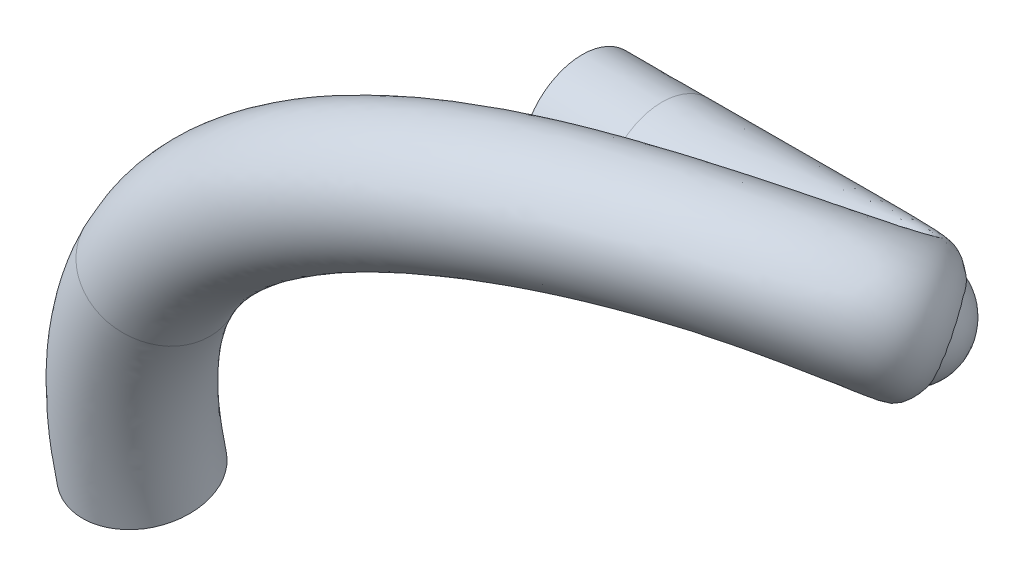
ISO-10303-21;
HEADER;
FILE_DESCRIPTION(('STEP AP214'),'2;1');
FILE_NAME('part.step','',(''),(''),'','','');
FILE_SCHEMA(('AUTOMOTIVE_DESIGN { 1 0 10303 214 1 1 1 1 }'));
ENDSEC;
DATA;
#1=APPLICATION_CONTEXT('core data for automotive mechanical design processes');
#2=APPLICATION_PROTOCOL_DEFINITION('international standard','automotive_design',2000,#1);
#3=PRODUCT_CONTEXT('',#1,'mechanical');
#4=PRODUCT('Part','Part','',(#3));
#5=PRODUCT_RELATED_PRODUCT_CATEGORY('part','',(#4));
#6=PRODUCT_DEFINITION_FORMATION('','',#4);
#7=PRODUCT_DEFINITION_CONTEXT('part definition',#1,'design');
#8=PRODUCT_DEFINITION('design','',#6,#7);
#9=PRODUCT_DEFINITION_SHAPE('','',#8);
#10=(LENGTH_UNIT() NAMED_UNIT(*) SI_UNIT(.MILLI.,.METRE.));
#11=(NAMED_UNIT(*) PLANE_ANGLE_UNIT() SI_UNIT($,.RADIAN.));
#12=(NAMED_UNIT(*) SI_UNIT($,.STERADIAN.) SOLID_ANGLE_UNIT());
#13=UNCERTAINTY_MEASURE_WITH_UNIT(LENGTH_MEASURE(1.E-05),#10,'distance_accuracy_value','');
#14=(GEOMETRIC_REPRESENTATION_CONTEXT(3) GLOBAL_UNCERTAINTY_ASSIGNED_CONTEXT((#13)) GLOBAL_UNIT_ASSIGNED_CONTEXT((#10,
#11,#12)) REPRESENTATION_CONTEXT('',''));
#15=CARTESIAN_POINT('',(0.,0.,0.));
#16=DIRECTION('',(0.,0.,1.));
#17=DIRECTION('',(1.,0.,0.));
#18=AXIS2_PLACEMENT_3D('',#15,#16,#17);
#19=CARTESIAN_POINT('',(0.,77.7946797883115,80.3650879164009));
#20=DIRECTION('',(0.,-0.97810611379634,-0.208106775848893));
#21=DIRECTION('',(-0.786276036500773,0.128584054759977,-0.604347694035576));
#22=AXIS2_PLACEMENT_3D('',#19,#20,#21);
#23=PLANE('',#22);
#24=CARTESIAN_POINT('',(-24.9642641588995,81.8772235269407,61.1770486307713));
#25=CARTESIAN_POINT('',(-30.10012505087,80.5171148322778,67.5695873852195));
#26=CARTESIAN_POINT('',(-32.5138841231119,78.7253930795708,75.9907163628611));
#27=CARTESIAN_POINT('',(-30.5343129763936,75.2903869238902,92.1353157306337));
#28=CARTESIAN_POINT('',(-26.1531726254029,73.6682547141992,99.7593703786035));
#29=CARTESIAN_POINT('',(-13.0819144780906,71.5306398113264,109.806204254691));
#30=CARTESIAN_POINT('',(-4.47228730281771,71.0283201931261,112.167116760482));
#31=CARTESIAN_POINT('',(12.0336920996729,71.4402823620331,110.230886119182));
#32=CARTESIAN_POINT('',(19.8284032669291,72.3520273550193,105.945665956479));
#33=CARTESIAN_POINT('',(30.10012505087,75.072244744345,93.1605884475822));
#34=CARTESIAN_POINT('',(32.5138841231119,76.8639664970521,84.7394594699407));
#35=CARTESIAN_POINT('',(30.5343129763937,80.2989726527326,68.5948601021681));
#36=CARTESIAN_POINT('',(26.153172625403,81.9211048624237,60.9708054541982));
#37=CARTESIAN_POINT('',(13.0819144780907,84.0587197652965,50.9239715781105));
#38=CARTESIAN_POINT('',(4.47228730281782,84.5610393834967,48.5630590723194));
#39=CARTESIAN_POINT('',(-12.0336920996728,84.1490772145897,50.4992897136193));
#40=CARTESIAN_POINT('',(-19.8284032669291,83.2373322216036,54.7845098763232));
#41=CARTESIAN_POINT('',(-24.9642641588995,81.8772235269407,61.1770486307713));
#42=B_SPLINE_CURVE_WITH_KNOTS('',3,(#24,#25,#26,#27,#28,#29,#30,#31,#32,#33,#34,#35,#36,#37,#38,
#39,#40,#41),.UNSPECIFIED.,.T.,.F.,(4,2,2,2,2,2,2,2,4),(0.,0.125,0.25,0.375,0.5,0.625,0.75,
0.875,1.),.UNSPECIFIED.);
#43=CARTESIAN_POINT('',(-24.9642641588995,81.8772235269407,61.1770486307713));
#44=VERTEX_POINT('',#43);
#45=EDGE_CURVE('E126',#44,#44,#42,.T.);
#46=ORIENTED_EDGE('',*,*,#45,.F.);
#47=EDGE_LOOP('',(#46));
#48=FACE_BOUND('',#47,.T.);
#49=ADVANCED_FACE('F45',(#48),#23,.T.);
#50=CARTESIAN_POINT('',(149.23,267.88,9.15933995315754E-13));
#51=DIRECTION('',(1.,0.,0.));
#52=DIRECTION('',(0.,0.,-1.));
#53=AXIS2_PLACEMENT_3D('',#50,#51,#52);
#54=PLANE('',#53);
#55=CARTESIAN_POINT('',(149.23,267.88,-31.7499999999991));
#56=CARTESIAN_POINT('',(149.23,276.192130562623,-31.7499999999991));
#57=CARTESIAN_POINT('',(149.23,284.453076415734,-28.3282041896106));
#58=CARTESIAN_POINT('',(149.23,296.208204189611,-16.5730764157333));
#59=CARTESIAN_POINT('',(149.23,299.63,-8.31213056262208));
#60=CARTESIAN_POINT('',(149.23,299.63,8.31213056262391));
#61=CARTESIAN_POINT('',(149.23,296.208204189611,16.5730764157351));
#62=CARTESIAN_POINT('',(149.23,284.453076415734,28.3282041896125));
#63=CARTESIAN_POINT('',(149.23,276.192130562623,31.7500000000009));
#64=CARTESIAN_POINT('',(149.23,259.567869437377,31.7500000000009));
#65=CARTESIAN_POINT('',(149.23,251.306923584266,28.3282041896125));
#66=CARTESIAN_POINT('',(149.23,239.551795810388,16.5730764157351));
#67=CARTESIAN_POINT('',(149.23,236.13,8.31213056262392));
#68=CARTESIAN_POINT('',(149.23,236.13,-8.31213056262207));
#69=CARTESIAN_POINT('',(149.23,239.551795810388,-16.5730764157333));
#70=CARTESIAN_POINT('',(149.23,251.306923584266,-28.3282041896106));
#71=CARTESIAN_POINT('',(149.23,259.567869437377,-31.7499999999991));
#72=CARTESIAN_POINT('',(149.23,267.88,-31.7499999999991));
#73=B_SPLINE_CURVE_WITH_KNOTS('',3,(#55,#56,#57,#58,#59,#60,#61,#62,#63,#64,#65,#66,#67,#68,#69,
#70,#71,#72),.UNSPECIFIED.,.T.,.F.,(4,2,2,2,2,2,2,2,4),(0.,0.125,0.25,0.375,0.5,0.625,0.75,
0.875,1.),.UNSPECIFIED.);
#74=CARTESIAN_POINT('',(149.23,267.88,-31.7499999999991));
#75=VERTEX_POINT('',#74);
#76=EDGE_CURVE('E59',#75,#75,#73,.T.);
#77=ORIENTED_EDGE('',*,*,#76,.F.);
#78=EDGE_LOOP('',(#77));
#79=FACE_BOUND('',#78,.T.);
#80=ADVANCED_FACE('F106',(#79),#54,.F.);
#81=CARTESIAN_POINT('',(4.98436154761423,205.538743408185,82.3359410502063));
#82=CARTESIAN_POINT('',(-13.9696499529726,171.847495775785,78.5948375263938));
#83=CARTESIAN_POINT('',(-25.072424811379,130.614782206991,71.6874000067005));
#84=CARTESIAN_POINT('',(-24.9642641588995,81.8772235269407,61.1770486307713));
#85=CARTESIAN_POINT('',(9.17506672756899,203.889008008475,75.3496800899277));
#86=CARTESIAN_POINT('',(-9.16188229056263,171.162992479714,71.7511725144789));
#87=CARTESIAN_POINT('',(-19.9726197620084,131.082144657172,65.0760000536511));
#88=CARTESIAN_POINT('',(-19.8284032669291,83.2373322216036,54.7845098763232));
#89=CARTESIAN_POINT('',(15.7694608624547,200.679559394852,70.2344818949174));
#90=CARTESIAN_POINT('',(-1.76051847680761,169.286484251854,66.840936594556));
#91=CARTESIAN_POINT('',(-12.2021217926382,130.77824518092,60.4882106189382));
#92=CARTESIAN_POINT('',(-12.0336920996728,84.1490772145897,50.4992897136193));
#93=CARTESIAN_POINT('',(30.0422209873294,192.953393185632,66.6344157040994));
#94=CARTESIAN_POINT('',(14.0503547350254,164.208995166282,63.6597990775961));
#95=CARTESIAN_POINT('',(4.29281694846403,128.799582808417,57.9502353266758));
#96=CARTESIAN_POINT('',(4.47228730281782,84.5610393834967,48.5630590723194));
#97=CARTESIAN_POINT('',(37.6326977095137,188.484252031646,68.1717163138964));
#98=CARTESIAN_POINT('',(22.3625036376363,161.039281025088,65.408486427253));
#99=CARTESIAN_POINT('',(12.9157093290807,127.13704825968,60.01568153296));
#100=CARTESIAN_POINT('',(13.0819144780907,84.0587197652965,50.9239715781105));
#101=CARTESIAN_POINT('',(49.4360183002746,180.857273809672,77.0529758037701));
#102=CARTESIAN_POINT('',(35.1069210909654,155.227636238036,74.597008904469));
#103=CARTESIAN_POINT('',(26.0436297742265,123.404361583702,69.6492733525902));
#104=CARTESIAN_POINT('',(26.153172625403,81.9211048624237,60.9708054541982));
#105=CARTESIAN_POINT('',(53.5761792954592,177.746402397358,84.3422453752548));
#106=CARTESIAN_POINT('',(39.4607116948822,152.621492677174,81.9802628970173));
#107=CARTESIAN_POINT('',(30.4678232892488,121.357188878404,77.1581252159709));
#108=CARTESIAN_POINT('',(30.5343129763937,80.2989726527326,68.5948601021681));
#109=CARTESIAN_POINT('',(55.9958352325577,174.68639256236,100.502309198044));
#110=CARTESIAN_POINT('',(41.6731667144009,149.480074464972,98.1559350994405));
#111=CARTESIAN_POINT('',(32.5385931605472,118.056987440081,93.3202361037685));
#112=CARTESIAN_POINT('',(32.5138841231119,76.8639664970521,84.7394594699407));
#113=CARTESIAN_POINT('',(54.2604303361892,174.756097165331,109.273592479056));
#114=CARTESIAN_POINT('',(39.5182069298508,148.964143685586,106.84874613591));
#115=CARTESIAN_POINT('',(30.172387062636,116.824229093993,101.873961516501));
#116=CARTESIAN_POINT('',(30.10012505087,75.072244744345,93.1605884475822));
#117=CARTESIAN_POINT('',(45.8790199766214,178.055567958776,123.246114412506));
#118=CARTESIAN_POINT('',(29.9026716567649,150.33314937266,120.536078111168));
#119=CARTESIAN_POINT('',(19.9727828367321,115.889401395599,115.096982948655));
#120=CARTESIAN_POINT('',(19.8284032669291,72.3520273550193,105.945665956479));
#121=CARTESIAN_POINT('',(39.2846258365245,181.265016561165,128.361312610758));
#122=CARTESIAN_POINT('',(22.5013070544874,152.209655900632,125.446314521821));
#123=CARTESIAN_POINT('',(12.2021953816326,116.193107955307,119.684828091094));
#124=CARTESIAN_POINT('',(12.0336920996729,71.4402823620331,110.230886119182));
#125=CARTESIAN_POINT('',(25.0118656979424,188.991182747482,131.961378797109));
#126=CARTESIAN_POINT('',(6.69043176776478,157.287141519189,128.627451362122));
#127=CARTESIAN_POINT('',(-4.29297891461475,118.171376697504,122.222726514317));
#128=CARTESIAN_POINT('',(-4.47228730281771,71.0283201931261,112.167116760482));
#129=CARTESIAN_POINT('',(17.4213889702286,193.460323894778,130.424078180575));
#130=CARTESIAN_POINT('',(-1.62171797129952,160.456854646799,126.878762992311));
#131=CARTESIAN_POINT('',(-12.915966194733,119.833796074818,120.157164445498));
#132=CARTESIAN_POINT('',(-13.0819144780906,71.5306398113264,109.806204254691));
#133=CARTESIAN_POINT('',(5.61806837899056,201.087302122514,121.542818677768));
#134=CARTESIAN_POINT('',(-14.3661354968493,166.26850030599,117.690238557405));
#135=CARTESIAN_POINT('',(-26.0438948383708,123.566581756061,110.523350388877));
#136=CARTESIAN_POINT('',(-26.1531726254029,73.6682547141992,99.7593703786035));
#137=CARTESIAN_POINT('',(1.4779073890179,204.198173546099,114.253549102954));
#138=CARTESIAN_POINT('',(-18.7199253124796,168.874645573335,110.306984061958));
#139=CARTESIAN_POINT('',(-30.4679989354685,125.613948235988,103.014441545741));
#140=CARTESIAN_POINT('',(-30.5343129763936,75.2903869238902,92.1353157306337));
#141=CARTESIAN_POINT('',(-0.94174853423754,207.25818340422,98.0934852846861));
#142=CARTESIAN_POINT('',(-20.9323782365987,172.016067285965,94.1313125433883));
#143=CARTESIAN_POINT('',(-32.5385309233311,128.914547097654,86.8524082343624));
#144=CARTESIAN_POINT('',(-32.5138841231119,78.7253930795708,75.9907163628611));
#145=CARTESIAN_POINT('',(0.793656367659463,207.188478807896,89.3222020104849));
#146=CARTESIAN_POINT('',(-18.7774176153825,172.531999071856,85.4385025383088));
#147=CARTESIAN_POINT('',(-30.1722298607496,130.147419756811,78.2987999597499));
#148=CARTESIAN_POINT('',(-30.10012505087,80.5171148322778,67.5695873852195));
#149=CARTESIAN_POINT('',(4.98436154761423,205.538743408185,82.3359410502063));
#150=CARTESIAN_POINT('',(-13.9696499529726,171.847495775785,78.5948375263938));
#151=CARTESIAN_POINT('',(-25.072424811379,130.614782206991,71.6874000067005));
#152=CARTESIAN_POINT('',(-24.9642641588995,81.8772235269407,61.1770486307713));
#153=B_SPLINE_SURFACE_WITH_KNOTS('',3,3,((#81,#82,#83,#84),(#85,#86,#87,#88),(#89,#90,#91,#92),
(#93,#94,#95,#96),(#97,#98,#99,#100),(#101,#102,#103,#104),(#105,#106,#107,#108),(#109,#110,
#111,#112),(#113,#114,#115,#116),(#117,#118,#119,#120),(#121,#122,#123,#124),(#125,#126,#127,
#128),(#129,#130,#131,#132),(#133,#134,#135,#136),(#137,#138,#139,#140),(#141,#142,#143,#144),
(#145,#146,#147,#148),(#149,#150,#151,#152)),.UNSPECIFIED.,.T.,.F.,.F.,(4,2,2,2,2,2,2,2,4),(4,
4),(0.,0.125,0.25,0.375,0.5,0.625,0.75,0.875,1.),(0.87555056375778,1.),.UNSPECIFIED.);
#154=CARTESIAN_POINT('',(4.98436154761423,205.538743408185,82.3359410502063));
#155=CARTESIAN_POINT('',(9.17506672756899,203.889008008475,75.3496800899277));
#156=CARTESIAN_POINT('',(15.7694608624547,200.679559394852,70.2344818949174));
#157=CARTESIAN_POINT('',(30.0422209873294,192.953393185632,66.6344157040994));
#158=CARTESIAN_POINT('',(37.6326977095137,188.484252031646,68.1717163138964));
#159=CARTESIAN_POINT('',(49.4360183002746,180.857273809672,77.0529758037701));
#160=CARTESIAN_POINT('',(53.5761792954592,177.746402397358,84.3422453752548));
#161=CARTESIAN_POINT('',(55.9958352325577,174.68639256236,100.502309198044));
#162=CARTESIAN_POINT('',(54.2604303361892,174.756097165331,109.273592479056));
#163=CARTESIAN_POINT('',(45.8790199766214,178.055567958776,123.246114412506));
#164=CARTESIAN_POINT('',(39.2846258365245,181.265016561165,128.361312610758));
#165=CARTESIAN_POINT('',(25.0118656979424,188.991182747482,131.961378797109));
#166=CARTESIAN_POINT('',(17.4213889702286,193.460323894778,130.424078180575));
#167=CARTESIAN_POINT('',(5.61806837899056,201.087302122514,121.542818677768));
#168=CARTESIAN_POINT('',(1.4779073890179,204.198173546099,114.253549102954));
#169=CARTESIAN_POINT('',(-0.94174853423754,207.25818340422,98.0934852846861));
#170=CARTESIAN_POINT('',(0.793656367659463,207.188478807896,89.3222020104849));
#171=CARTESIAN_POINT('',(4.98436154761423,205.538743408185,82.3359410502063));
#172=B_SPLINE_CURVE_WITH_KNOTS('',3,(#154,#155,#156,#157,#158,#159,#160,#161,#162,#163,#164,
#165,#166,#167,#168,#169,#170,#171),.UNSPECIFIED.,.T.,.F.,(4,2,2,2,2,2,2,2,4),(0.,0.125,0.25,
0.375,0.5,0.625,0.75,0.875,1.),.UNSPECIFIED.);
#173=CARTESIAN_POINT('',(4.98436154761423,205.538743408185,82.3359410502063));
#174=VERTEX_POINT('',#173);
#175=EDGE_CURVE('E54',#174,#174,#172,.F.);
#176=ORIENTED_EDGE('',*,*,#175,.F.);
#177=EDGE_LOOP('',(#176));
#178=FACE_BOUND('',#177,.T.);
#179=ORIENTED_EDGE('',*,*,#45,.T.);
#180=EDGE_LOOP('',(#179));
#181=FACE_BOUND('',#180,.T.);
#182=ADVANCED_FACE('F94',(#178,#181),#153,.T.);
#183=CARTESIAN_POINT('',(149.23,267.88,-31.7499999999991));
#184=CARTESIAN_POINT('',(164.952137417693,268.128101616908,-31.7500176062774));
#185=CARTESIAN_POINT('',(179.616615962847,268.541811044701,-31.6074749629089));
#186=CARTESIAN_POINT('',(193.28717742382,269.104079109609,-31.328169279097));
#187=CARTESIAN_POINT('',(149.23,276.192130562623,-31.7499999999991));
#188=CARTESIAN_POINT('',(164.891603180559,276.440164923122,-31.6850647554337));
#189=CARTESIAN_POINT('',(179.494438029569,276.853376250013,-31.4746429440781));
#190=CARTESIAN_POINT('',(193.09732674015,277.413319073549,-31.1264540207259));
#191=CARTESIAN_POINT('',(149.23,284.453076415734,-28.3282041896106));
#192=CARTESIAN_POINT('',(164.809201525555,284.674297522528,-28.1987814308829));
#193=CARTESIAN_POINT('',(179.328513714425,285.059389335438,-27.921109813111));
#194=CARTESIAN_POINT('',(192.840306192462,285.588293980301,-27.5053347330421));
#195=CARTESIAN_POINT('',(149.23,296.208204189611,-16.5730764157333));
#196=CARTESIAN_POINT('',(164.647229581259,296.3375325203,-16.3520167146675));
#197=CARTESIAN_POINT('',(179.00291879153,296.627064681963,-15.979073351153));
#198=CARTESIAN_POINT('',(192.337116262198,297.054010888756,-15.4688804995937));
#199=CARTESIAN_POINT('',(149.23,299.63,-8.31213056262208));
#200=CARTESIAN_POINT('',(164.568682018498,299.694840943821,-8.06445640985924));
#201=CARTESIAN_POINT('',(178.845291718597,299.917535148157,-7.66406244876623));
#202=CARTESIAN_POINT('',(192.0940894994,300.274194627999,-7.12761304504192));
#203=CARTESIAN_POINT('',(149.23,299.63,8.31213056262391));
#204=CARTESIAN_POINT('',(164.460854209474,299.565189977566,8.55968661756079));
#205=CARTESIAN_POINT('',(178.629440602845,299.653827801507,8.9591579671565));
#206=CARTESIAN_POINT('',(191.762462698835,299.870983683687,9.49140966155865));
#207=CARTESIAN_POINT('',(149.23,296.208204189611,16.5730764157351));
#208=CARTESIAN_POINT('',(164.432237542559,296.078998393139,16.7939266790896));
#209=CARTESIAN_POINT('',(178.572545116171,296.101227308834,17.1650441126282));
#210=CARTESIAN_POINT('',(191.675904056268,296.250018742241,17.6668730308091));
#211=CARTESIAN_POINT('',(149.23,284.453076415734,28.3282041896125));
#212=CARTESIAN_POINT('',(164.441714360087,284.232209517722,28.4574197237415));
#213=CARTESIAN_POINT('',(178.592875016448,284.160309296135,28.7320491333627));
#214=CARTESIAN_POINT('',(191.710096645689,284.213728041326,29.1335604660798));
#215=CARTESIAN_POINT('',(149.23,276.192130562623,31.7500000000009));
#216=CARTESIAN_POINT('',(164.479723320851,275.944537872156,31.8148196158563));
#217=CARTESIAN_POINT('',(178.669935365172,275.845484033323,32.0218927327322));
#218=CARTESIAN_POINT('',(191.830591809254,275.872476436889,32.3541202280524));
#219=CARTESIAN_POINT('',(149.23,259.567869437377,31.7500000000009));
#220=CARTESIAN_POINT('',(164.600782530077,259.320135794644,31.6851434846344));
#221=CARTESIAN_POINT('',(178.914277121945,259.221934113881,31.7565783104586));
#222=CARTESIAN_POINT('',(192.210277060692,259.253517353053,31.9510890361515));
#223=CARTESIAN_POINT('',(149.23,251.306923584266,28.3282041896125));
#224=CARTESIAN_POINT('',(164.683089011158,251.085806546521,28.1988423155714));
#225=CARTESIAN_POINT('',(179.08005649562,251.015621549906,28.2030180038933));
#226=CARTESIAN_POINT('',(192.467132058602,251.078200386853,28.3299387089612));
#227=CARTESIAN_POINT('',(149.23,239.551795810388,16.5730764157351));
#228=CARTESIAN_POINT('',(164.844825849156,239.422341972026,16.351802184368));
#229=CARTESIAN_POINT('',(179.40529337259,239.447596578457,16.2605621094054));
#230=CARTESIAN_POINT('',(192.969913034857,239.612084142657,16.2930054066854));
#231=CARTESIAN_POINT('',(149.23,236.13,8.31213056262392));
#232=CARTESIAN_POINT('',(164.923285419139,236.065051383082,8.06404511711669));
#233=CARTESIAN_POINT('',(179.562786440248,236.157153272737,7.94525155531718));
#234=CARTESIAN_POINT('',(193.212786738957,236.391931425653,7.95139569496499));
#235=CARTESIAN_POINT('',(149.23,236.13,-8.31213056262207));
#236=CARTESIAN_POINT('',(165.031122418092,236.194977849417,-8.5603276598429));
#237=CARTESIAN_POINT('',(179.778651551546,236.421280181497,-8.67831874871392));
#238=CARTESIAN_POINT('',(193.544429525115,236.79562158679,-8.66802664798071));
#239=CARTESIAN_POINT('',(149.23,239.551795810388,-16.5730764157333));
#240=CARTESIAN_POINT('',(165.05983426605,239.681366193646,-16.7945498547768));
#241=CARTESIAN_POINT('',(179.835691990481,239.974180321845,-16.8841776849541));
#242=CARTESIAN_POINT('',(193.63115372973,240.416928780799,-16.8434589393058));
#243=CARTESIAN_POINT('',(149.23,251.306923584266,-28.3282041896106));
#244=CARTESIAN_POINT('',(165.050592629108,251.528384606915,-28.4577673053765));
#245=CARTESIAN_POINT('',(179.815720249365,251.915447900269,-28.4507630004632));
#246=CARTESIAN_POINT('',(193.59737022377,252.453618749837,-28.3096669942841));
#247=CARTESIAN_POINT('',(149.23,259.567869437377,-31.7499999999991));
#248=CARTESIAN_POINT('',(165.012671654828,259.816038310695,-31.814970457121));
#249=CARTESIAN_POINT('',(179.738793896125,260.230245839389,-31.7403069817397));
#250=CARTESIAN_POINT('',(193.47702810749,260.794839145668,-31.529884537468));
#251=CARTESIAN_POINT('',(149.23,267.88,-31.7499999999991));
#252=CARTESIAN_POINT('',(164.952137417693,268.128101616908,-31.7500176062774));
#253=CARTESIAN_POINT('',(179.616615962847,268.541811044701,-31.6074749629089));
#254=CARTESIAN_POINT('',(193.28717742382,269.104079109609,-31.328169279097));
#255=B_SPLINE_SURFACE_WITH_KNOTS('',3,3,((#183,#184,#185,#186),(#187,#188,#189,#190),(#191,#192,
#193,#194),(#195,#196,#197,#198),(#199,#200,#201,#202),(#203,#204,#205,#206),(#207,#208,#209,
#210),(#211,#212,#213,#214),(#215,#216,#217,#218),(#219,#220,#221,#222),(#223,#224,#225,#226),
(#227,#228,#229,#230),(#231,#232,#233,#234),(#235,#236,#237,#238),(#239,#240,#241,#242),(#243,
#244,#245,#246),(#247,#248,#249,#250),(#251,#252,#253,#254)),.UNSPECIFIED.,.T.,.F.,.F.,(4,2,2,2,
2,2,2,2,4),(4,4),(0.,0.125,0.25,0.375,0.5,0.625,0.75,0.875,1.),(0.,0.0298180605057714),.UNSPECIFIED.);
#256=CARTESIAN_POINT('',(193.28717742382,269.104079109609,-31.328169279097));
#257=CARTESIAN_POINT('',(193.09732674015,277.413319073549,-31.1264540207259));
#258=CARTESIAN_POINT('',(192.840306192462,285.588293980301,-27.5053347330421));
#259=CARTESIAN_POINT('',(192.337116262198,297.054010888756,-15.4688804995937));
#260=CARTESIAN_POINT('',(192.0940894994,300.274194627999,-7.12761304504192));
#261=CARTESIAN_POINT('',(191.762462698835,299.870983683687,9.49140966155865));
#262=CARTESIAN_POINT('',(191.675904056268,296.250018742241,17.6668730308091));
#263=CARTESIAN_POINT('',(191.710096645689,284.213728041326,29.1335604660798));
#264=CARTESIAN_POINT('',(191.830591809254,275.872476436889,32.3541202280524));
#265=CARTESIAN_POINT('',(192.210277060692,259.253517353053,31.9510890361515));
#266=CARTESIAN_POINT('',(192.467132058602,251.078200386853,28.3299387089612));
#267=CARTESIAN_POINT('',(192.969913034857,239.612084142657,16.2930054066854));
#268=CARTESIAN_POINT('',(193.212786738957,236.391931425653,7.95139569496499));
#269=CARTESIAN_POINT('',(193.544429525115,236.79562158679,-8.66802664798071));
#270=CARTESIAN_POINT('',(193.63115372973,240.416928780799,-16.8434589393058));
#271=CARTESIAN_POINT('',(193.59737022377,252.453618749837,-28.3096669942841));
#272=CARTESIAN_POINT('',(193.47702810749,260.794839145668,-31.529884537468));
#273=CARTESIAN_POINT('',(193.28717742382,269.104079109609,-31.328169279097));
#274=B_SPLINE_CURVE_WITH_KNOTS('',3,(#256,#257,#258,#259,#260,#261,#262,#263,#264,#265,#266,
#267,#268,#269,#270,#271,#272,#273),.UNSPECIFIED.,.T.,.F.,(4,2,2,2,2,2,2,2,4),(0.,0.125,0.25,
0.375,0.5,0.625,0.75,0.875,1.),.UNSPECIFIED.);
#275=CARTESIAN_POINT('',(193.28717742382,269.104079109609,-31.328169279097));
#276=VERTEX_POINT('',#275);
#277=EDGE_CURVE('E11',#276,#276,#274,.T.);
#278=ORIENTED_EDGE('',*,*,#76,.T.);
#279=EDGE_LOOP('',(#278));
#280=FACE_BOUND('',#279,.T.);
#281=ORIENTED_EDGE('',*,*,#277,.F.);
#282=EDGE_LOOP('',(#281));
#283=FACE_BOUND('',#282,.T.);
#284=ADVANCED_FACE('F81',(#280,#283),#255,.T.);
#285=CARTESIAN_POINT('',(193.28717742382,269.104079109609,-31.328169279097));
#286=CARTESIAN_POINT('',(322.533658350056,274.419966751386,-28.6875113340344));
#287=CARTESIAN_POINT('',(424.212075655493,337.530915504561,38.2592622267894));
#288=CARTESIAN_POINT('',(199.531183978553,352.045598123335,73.4410407682274));
#289=CARTESIAN_POINT('',(47.9202024724882,281.858315592714,90.8105283837069));
#290=CARTESIAN_POINT('',(4.98436154761423,205.538743408185,82.3359410502063));
#291=CARTESIAN_POINT('',(193.09732674015,277.413319073549,-31.1264540207259));
#292=CARTESIAN_POINT('',(321.704004768188,282.707223034158,-27.8345487709496));
#293=CARTESIAN_POINT('',(414.40352382035,339.166089881334,30.6897899661791));
#294=CARTESIAN_POINT('',(199.689193453598,346.906577659175,66.0423198447075));
#295=CARTESIAN_POINT('',(50.713098192077,278.022074605193,83.5012499473979));
#296=CARTESIAN_POINT('',(9.17506672756899,203.889008008475,75.3496800899277));
#297=CARTESIAN_POINT('',(192.840306192462,285.588293980301,-27.5053347330421));
#298=CARTESIAN_POINT('',(320.585727167113,290.588751663706,-23.5744452732976));
#299=CARTESIAN_POINT('',(401.377288713703,336.902188089978,22.4306001895841));
#300=CARTESIAN_POINT('',(201.380376021784,338.791432353531,60.5752910041763));
#301=CARTESIAN_POINT('',(55.4794929210294,271.793164050027,77.9217580782847));
#302=CARTESIAN_POINT('',(15.7694608624547,200.679559394852,70.2344818949174));
#303=CARTESIAN_POINT('',(192.337116262198,297.054010888756,-15.4688804995937));
#304=CARTESIAN_POINT('',(318.403489174482,301.090516260563,-10.6453309441486));
#305=CARTESIAN_POINT('',(376.244411315757,325.854351267061,9.19618105916052));
#306=CARTESIAN_POINT('',(206.87421177394,321.19100702674,56.5914788935617));
#307=CARTESIAN_POINT('',(66.2680207595586,258.06704476288,73.3727078215301));
#308=CARTESIAN_POINT('',(30.0422209873294,192.953393185632,66.6344157040994));
#309=CARTESIAN_POINT('',(192.0940894994,300.274194627999,-7.12761304504192));
#310=CARTESIAN_POINT('',(317.353062553323,303.646183612517,-2.05582445579641));
#311=CARTESIAN_POINT('',(364.292488254299,317.138400420007,4.30239524288066));
#312=CARTESIAN_POINT('',(210.643047852509,311.814121151889,58.0992421073431));
#313=CARTESIAN_POINT('',(72.2237194328951,250.65435830645,74.4311616480975));
#314=CARTESIAN_POINT('',(37.6326977095137,188.484252031646,68.1717163138964));
#315=CARTESIAN_POINT('',(191.762462698835,299.870983683687,9.49140966155865));
#316=CARTESIAN_POINT('',(315.926850143998,301.924054705264,14.5235115737507));
#317=CARTESIAN_POINT('',(348.36604095047,298.243748890518,0.724702907134998));
#318=CARTESIAN_POINT('',(218.096571581612,297.201490645981,67.2628207687157));
#319=CARTESIAN_POINT('',(81.8952071298764,238.91517050895,82.6163893377252));
#320=CARTESIAN_POINT('',(49.4360183002746,180.857273809672,77.0529758037701));
#321=CARTESIAN_POINT('',(191.675904056268,296.250018742241,17.6668730308091));
#322=CARTESIAN_POINT('',(315.559845191797,297.65674729649,22.4113469053514));
#323=CARTESIAN_POINT('',(344.489589812448,288.181452335064,2.06278114536094));
#324=CARTESIAN_POINT('',(221.735361520672,292.055712663315,74.8622218358092));
#325=CARTESIAN_POINT('',(85.5514406516005,234.660957237851,89.6927593785765));
#326=CARTESIAN_POINT('',(53.5761792954592,177.746402397358,84.3422453752548));
#327=CARTESIAN_POINT('',(191.710096645689,284.213728041326,29.1335604660798));
#328=CARTESIAN_POINT('',(315.725100707431,284.718768368395,32.9295952488369));
#329=CARTESIAN_POINT('',(347.099075686711,272.508569762003,10.2372797379682));
#330=CARTESIAN_POINT('',(226.782398542699,288.990656471643,91.8053782635676));
#331=CARTESIAN_POINT('',(88.4404613791795,231.785358873409,105.817466100039));
#332=CARTESIAN_POINT('',(55.9958352325577,174.68639256236,100.502309198044));
#333=CARTESIAN_POINT('',(191.830591809254,275.872476436889,32.3541202280524));
#334=CARTESIAN_POINT('',(316.256244474118,276.127672478589,35.4951203076511));
#335=CARTESIAN_POINT('',(353.568990242892,266.994538868165,17.0234181498407));
#336=CARTESIAN_POINT('',(228.15955331898,291.090239315151,101.044784627029));
#337=CARTESIAN_POINT('',(87.6554590895431,233.181682256593,114.766509735821));
#338=CARTESIAN_POINT('',(54.2604303361892,174.756097165331,109.273592479056));
#339=CARTESIAN_POINT('',(192.210277060692,259.253517353053,31.9510890361515));
#340=CARTESIAN_POINT('',(317.915516555385,259.552116831271,33.7900644776492));
#341=CARTESIAN_POINT('',(373.186110269576,263.724677156481,32.1619564157287));
#342=CARTESIAN_POINT('',(227.843529745199,301.36814021962,115.842344423482));
#343=CARTESIAN_POINT('',(82.0696675342914,240.854166262334,129.385062230031));
#344=CARTESIAN_POINT('',(45.8790199766214,178.055567958776,123.246114412506));
#345=CARTESIAN_POINT('',(192.467132058602,251.078200386853,28.3299387089612));
#346=CARTESIAN_POINT('',(319.033433768189,251.669843566908,29.5298934096904));
#347=CARTESIAN_POINT('',(386.212513793182,265.988926953012,40.4211775782631));
#348=CARTESIAN_POINT('',(226.152298300152,309.483184459375,121.309364768701));
#349=CARTESIAN_POINT('',(77.3032745745336,247.083080631504,134.964552998109));
#350=CARTESIAN_POINT('',(39.2846258365245,181.265016561165,128.361312610758));
#351=CARTESIAN_POINT('',(192.969913034857,239.612084142657,16.2930054066854));
#352=CARTESIAN_POINT('',(321.214781503191,241.167209650096,16.5997361883764));
#353=CARTESIAN_POINT('',(411.345807265457,277.037170495558,53.6560835942962));
#354=CARTESIAN_POINT('',(220.658341674259,327.083490247364,125.293037117933));
#355=CARTESIAN_POINT('',(66.5147513914187,260.809207697582,139.513604773081));
#356=CARTESIAN_POINT('',(25.0118656979424,188.991182747482,131.961378797109));
#357=CARTESIAN_POINT('',(193.212786738957,236.391931425653,7.95139569496499));
#358=CARTESIAN_POINT('',(322.264874927621,238.611609830919,8.00948463520827));
#359=CARTESIAN_POINT('',(423.297886068962,285.753090130745,58.5502174125335));
#360=CARTESIAN_POINT('',(216.88946029365,336.460384064611,123.785173494514));
#361=CARTESIAN_POINT('',(60.5590545948113,268.221896428187,138.455153235423));
#362=CARTESIAN_POINT('',(17.4213889702286,193.460323894778,130.424078180575));
#363=CARTESIAN_POINT('',(193.544429525115,236.79562158679,-8.66802664798071));
#364=CARTESIAN_POINT('',(323.69112213718,240.334781952455,-8.57072136868377));
#365=CARTESIAN_POINT('',(439.224317154298,304.647254566043,62.1283163218679));
#366=CARTESIAN_POINT('',(209.435941128954,351.073154578736,114.62147678709));
#367=CARTESIAN_POINT('',(50.8875670598761,279.961082268889,130.26992993826));
#368=CARTESIAN_POINT('',(5.61806837899056,201.087302122514,121.542818677768));
#369=CARTESIAN_POINT('',(193.63115372973,240.416928780799,-16.8434589393058));
#370=CARTESIAN_POINT('',(324.058487503884,244.602834415958,-16.458489046313));
#371=CARTESIAN_POINT('',(443.100599863044,314.709202918927,60.79020666248));
#372=CARTESIAN_POINT('',(205.797200070542,356.219033688338,107.022084213129));
#373=CARTESIAN_POINT('',(47.2313317694911,284.215291711127,123.193561025744));
#374=CARTESIAN_POINT('',(1.4779073890179,204.198173546099,114.253549102954));
#375=CARTESIAN_POINT('',(193.59737022377,252.453618749837,-28.3096669942841));
#376=CARTESIAN_POINT('',(323.89412252864,257.541682516813,-26.975693819631));
#377=CARTESIAN_POINT('',(440.490697776317,330.38167883025,52.6152208655127));
#378=CARTESIAN_POINT('',(200.750283981619,359.284209436917,90.0790676453717));
#379=CARTESIAN_POINT('',(44.3423063404822,287.090882221707,107.06885276993));
#380=CARTESIAN_POINT('',(-0.94174853423754,207.25818340422,98.0934852846861));
#381=CARTESIAN_POINT('',(193.47702810749,260.794839145668,-31.529884537468));
#382=CARTESIAN_POINT('',(323.363311931923,266.132710468613,-29.5404738971191));
#383=CARTESIAN_POINT('',(434.020627490637,335.895741127789,45.8287344873997));
#384=CARTESIAN_POINT('',(199.373174503507,357.184618587495,80.8397616917474));
#385=CARTESIAN_POINT('',(45.1273067528994,285.694556580235,98.119806820016));
#386=CARTESIAN_POINT('',(0.793656367659463,207.188478807896,89.3222020104849));
#387=CARTESIAN_POINT('',(193.28717742382,269.104079109609,-31.328169279097));
#388=CARTESIAN_POINT('',(322.533658350056,274.419966751386,-28.6875113340344));
#389=CARTESIAN_POINT('',(424.212075655493,337.530915504561,38.2592622267894));
#390=CARTESIAN_POINT('',(199.531183978553,352.045598123335,73.4410407682274));
#391=CARTESIAN_POINT('',(47.9202024724882,281.858315592714,90.8105283837069));
#392=CARTESIAN_POINT('',(4.98436154761423,205.538743408185,82.3359410502063));
#393=B_SPLINE_SURFACE_WITH_KNOTS('',3,3,((#285,#286,#287,#288,#289,#290),(#291,#292,#293,#294,
#295,#296),(#297,#298,#299,#300,#301,#302),(#303,#304,#305,#306,#307,#308),(#309,#310,#311,#312,
#313,#314),(#315,#316,#317,#318,#319,#320),(#321,#322,#323,#324,#325,#326),(#327,#328,#329,#330,
#331,#332),(#333,#334,#335,#336,#337,#338),(#339,#340,#341,#342,#343,#344),(#345,#346,#347,#348,
#349,#350),(#351,#352,#353,#354,#355,#356),(#357,#358,#359,#360,#361,#362),(#363,#364,#365,#366,
#367,#368),(#369,#370,#371,#372,#373,#374),(#375,#376,#377,#378,#379,#380),(#381,#382,#383,#384,
#385,#386),(#387,#388,#389,#390,#391,#392)),.UNSPECIFIED.,.T.,.F.,.F.,(4,2,2,2,2,2,2,2,4),(4,1,
1,4),(0.,0.125,0.25,0.375,0.5,0.625,0.75,0.875,1.),(0.0298180605057714,0.311728894923108,
0.593639729340444,0.87555056375778),.UNSPECIFIED.);
#394=ORIENTED_EDGE('',*,*,#277,.T.);
#395=EDGE_LOOP('',(#394));
#396=FACE_BOUND('',#395,.T.);
#397=ORIENTED_EDGE('',*,*,#175,.T.);
#398=EDGE_LOOP('',(#397));
#399=FACE_BOUND('',#398,.T.);
#400=ADVANCED_FACE('F93',(#396,#399),#393,.T.);
#401=CLOSED_SHELL('',(#49,#80,#182,#284,#400));
#402=MANIFOLD_SOLID_BREP('B2',#401);
#403=CARTESIAN_POINT('',(0.,77.7946797883115,80.3650879164009));
#404=DIRECTION('',(0.,-0.97810611379634,-0.208106775848893));
#405=DIRECTION('',(-0.786276036500773,0.128584054759977,-0.604347694035576));
#406=AXIS2_PLACEMENT_3D('',#403,#404,#405);
#407=PLANE('',#406);
#408=CARTESIAN_POINT('',(0.,77.7946797883115,80.3650879164009));
#409=DIRECTION('',(0.,0.97810611379634,0.208106775848893));
#410=DIRECTION('',(-0.786276036500773,0.128584054759977,-0.604347694035576));
#411=AXIS2_PLACEMENT_3D('',#408,#409,#410);
#412=CIRCLE('',#411,25.4);
#413=CARTESIAN_POINT('',(-19.9714113271196,81.0607147792149,65.0146564878972));
#414=VERTEX_POINT('',#413);
#415=EDGE_CURVE('E198',#414,#414,#412,.T.);
#416=ORIENTED_EDGE('',*,*,#415,.F.);
#417=EDGE_LOOP('',(#416));
#418=FACE_BOUND('',#417,.T.);
#419=ADVANCED_FACE('F195',(#418),#407,.T.);
#420=CARTESIAN_POINT('',(149.23,267.88,9.15933995315754E-13));
#421=DIRECTION('',(1.,0.,0.));
#422=DIRECTION('',(0.,0.,-1.));
#423=AXIS2_PLACEMENT_3D('',#420,#421,#422);
#424=PLANE('',#423);
#425=CARTESIAN_POINT('',(149.23,267.88,9.15933995315754E-13));
#426=DIRECTION('',(1.,0.,0.));
#427=DIRECTION('',(0.,0.,-1.));
#428=AXIS2_PLACEMENT_3D('',#425,#426,#427);
#429=CIRCLE('',#428,25.4);
#430=CARTESIAN_POINT('',(149.23,267.88,-25.3999999999991));
#431=VERTEX_POINT('',#430);
#432=EDGE_CURVE('E207',#431,#431,#429,.T.);
#433=ORIENTED_EDGE('',*,*,#432,.F.);
#434=EDGE_LOOP('',(#433));
#435=FACE_BOUND('',#434,.T.);
#436=ADVANCED_FACE('F228',(#435),#424,.F.);
#437=CARTESIAN_POINT('',(198.486692857128,326.037280538509,74.8486395906202));
#438=CARTESIAN_POINT('',(191.367271951773,324.527084099599,75.9842888670005));
#439=CARTESIAN_POINT('',(184.186281846494,322.81062351935,77.0872520807974));
#440=CARTESIAN_POINT('',(161.164409532277,316.615082884798,80.4653562607818));
#441=CARTESIAN_POINT('',(145.22544455962,311.282872709263,82.5636598691783));
#442=CARTESIAN_POINT('',(113.926902060716,298.005292176672,86.012411425622));
#443=CARTESIAN_POINT('',(98.5654699594412,290.0576255691,87.3627720969476));
#444=CARTESIAN_POINT('',(69.3485836647402,271.041005413255,89.0194045795362));
#445=CARTESIAN_POINT('',(55.4921216705527,259.96677712053,89.325064719038));
#446=CARTESIAN_POINT('',(30.3705569425716,234.249277628087,88.6075080759558));
#447=CARTESIAN_POINT('',(19.112440759926,219.601813084627,87.5822972729991));
#448=CARTESIAN_POINT('',(0.36782438126194,186.524111663204,83.970190143309));
#449=CARTESIAN_POINT('',(-7.11071816797762,168.102617216829,81.3839861179303));
#450=CARTESIAN_POINT('',(-17.2993274248205,127.459781871041,74.505965040786));
#451=CARTESIAN_POINT('',(-20.01489681457,105.246296115599,70.2170784417276));
#452=CARTESIAN_POINT('',(-19.9714113271196,81.0607147792149,65.0146564878972));
#453=CARTESIAN_POINT('',(193.598233322286,303.357397001173,29.6544080977829));
#454=CARTESIAN_POINT('',(187.367654640123,301.372507454265,30.932325246934));
#455=CARTESIAN_POINT('',(181.092562196464,299.274498485713,32.1642648599878));
#456=CARTESIAN_POINT('',(161.027790767959,292.142568910656,35.8972346588965));
#457=CARTESIAN_POINT('',(147.219310311487,286.58650526842,38.1575484344113));
#458=CARTESIAN_POINT('',(120.437527344229,273.688501717058,41.829900651586));
#459=CARTESIAN_POINT('',(107.468548508459,266.346837399075,43.2435090137448));
#460=CARTESIAN_POINT('',(83.2099662911122,249.505280985213,45.0643104121338));
#461=CARTESIAN_POINT('',(71.9226571192648,240.012284454363,45.4733588551193));
#462=CARTESIAN_POINT('',(51.70736830188,218.498519699274,45.15902725604));
#463=CARTESIAN_POINT('',(42.7711992983796,206.483662358096,44.4386538317671));
#464=CARTESIAN_POINT('',(27.832136589238,179.320932051023,41.6970016910525));
#465=CARTESIAN_POINT('',(21.8195856770936,164.162810853594,39.6751211006546));
#466=CARTESIAN_POINT('',(13.531340515065,129.898231947766,34.062945231123));
#467=CARTESIAN_POINT('',(11.2624981400166,110.782417309966,30.4691525839702));
#468=CARTESIAN_POINT('',(11.4166583556753,89.3730868200927,25.9463374475028));
#469=CARTESIAN_POINT('',(206.375019113632,258.871242485726,50.5957090193088));
#470=CARTESIAN_POINT('',(200.849998185432,257.320143919156,52.3642026472263));
#471=CARTESIAN_POINT('',(195.272713752228,255.65777366012,54.0268846195874));
#472=CARTESIAN_POINT('',(177.455660572908,249.923228262028,58.9685974567773));
#473=CARTESIAN_POINT('',(165.221547131019,245.340652017616,61.8130867987309));
#474=CARTESIAN_POINT('',(141.812282535215,234.634553942824,66.3817730821117));
#475=CARTESIAN_POINT('',(130.645164210565,228.515900200719,68.1077144931944));
#476=CARTESIAN_POINT('',(110.17686540693,214.677191145376,70.4878142816686));
#477=CARTESIAN_POINT('',(100.879994739834,206.974580882489,71.1450514052202));
#478=CARTESIAN_POINT('',(84.4773415892053,189.78956880386,71.4454885432103));
#479=CARTESIAN_POINT('',(77.3493966448348,180.321464558147,71.0956832137878));
#480=CARTESIAN_POINT('',(65.3139862297403,158.723321439485,69.2933587983434));
#481=CARTESIAN_POINT('',(60.3809482577232,146.565549473753,67.8388532367279));
#482=CARTESIAN_POINT('',(53.3611724064603,118.102540268124,63.4616569251397));
#483=CARTESIAN_POINT('',(51.2922917663893,101.772235814153,60.5296079076432));
#484=CARTESIAN_POINT('',(51.3594810099147,82.8410168382859,56.64720030451));
#485=CARTESIAN_POINT('',(211.263478648438,281.551126022815,95.789940512076));
#486=CARTESIAN_POINT('',(204.849615497061,280.474720564231,97.4161662672499));
#487=CARTESIAN_POINT('',(198.366433402259,279.193898693558,98.949871840397));
#488=CARTESIAN_POINT('',(177.592279337226,274.395742236607,103.536719058663));
#489=CARTESIAN_POINT('',(163.22768137904,270.037019458459,106.21919823361));
#490=CARTESIAN_POINT('',(135.301657251814,258.951344402437,110.564283856036));
#491=CARTESIAN_POINT('',(121.742085661547,252.226688370406,112.226977576397));
#492=CARTESIAN_POINT('',(96.3154827805575,236.212915573756,114.442908449071));
#493=CARTESIAN_POINT('',(84.4494592910644,226.929073548656,114.996757269139));
#494=CARTESIAN_POINT('',(63.1405302299542,205.540326732674,114.893969363126));
#495=CARTESIAN_POINT('',(53.6906381064116,193.439615284678,114.239326655141));
#496=CARTESIAN_POINT('',(37.8496740217339,165.926501051667,111.566547250478));
#497=CARTESIAN_POINT('',(31.4506444126519,150.505355836989,109.54771825414));
#498=CARTESIAN_POINT('',(22.5305044665748,115.664090191399,103.904676734666));
#499=CARTESIAN_POINT('',(20.0148968113143,96.2361146197863,100.277533764424));
#500=CARTESIAN_POINT('',(19.9714113271197,74.528644797408,95.7155193449045));
#501=CARTESIAN_POINT('',(216.151938183245,304.231009559904,140.984172004843));
#502=CARTESIAN_POINT('',(208.849232808691,303.629297209305,142.468129887273));
#503=CARTESIAN_POINT('',(201.460153052289,302.730023726995,143.872859061207));
#504=CARTESIAN_POINT('',(177.728898101544,298.868256211186,148.104840660548));
#505=CARTESIAN_POINT('',(161.233815627062,294.733386899302,150.625309668489));
#506=CARTESIAN_POINT('',(128.791031968413,283.268134862051,154.74679462996));
#507=CARTESIAN_POINT('',(112.839007112529,275.937476540092,156.3462406596));
#508=CARTESIAN_POINT('',(82.4541001541855,257.748640002136,158.398002616473));
#509=CARTESIAN_POINT('',(68.0189238422949,246.883566214823,158.848463133058));
#510=CARTESIAN_POINT('',(41.8037188707032,221.291084661487,158.342450183042));
#511=CARTESIAN_POINT('',(30.0318795679884,206.557766011209,157.382970096495));
#512=CARTESIAN_POINT('',(10.3853618137274,173.129680663848,153.839735702613));
#513=CARTESIAN_POINT('',(2.52034056758077,154.445162200224,151.256583271553));
#514=CARTESIAN_POINT('',(-8.30016347331069,113.225640114673,144.347696544192));
#515=CARTESIAN_POINT('',(-11.2624981437606,90.6999934254198,140.025459621205));
#516=CARTESIAN_POINT('',(-11.4166583556752,66.2162727565301,134.783838385299));
#517=CARTESIAN_POINT('',(203.375152391969,348.717164075844,120.042871083457));
#518=CARTESIAN_POINT('',(195.366889263424,347.681660744933,121.036252487067));
#519=CARTESIAN_POINT('',(187.280001496525,346.346748552986,122.010239301607));
#520=CARTESIAN_POINT('',(161.301028296596,341.08759685894,125.033477862667));
#521=CARTESIAN_POINT('',(143.231578807754,335.979240150106,126.969771303945));
#522=CARTESIAN_POINT('',(107.416276777203,322.322082636285,130.194922199658));
#523=CARTESIAN_POINT('',(89.6623914104233,313.768413739125,131.48203518015));
#524=CARTESIAN_POINT('',(55.4872010383682,292.576729841296,132.974498746938));
#525=CARTESIAN_POINT('',(39.0615862218405,279.921269786697,133.176770582957));
#526=CARTESIAN_POINT('',(9.03374558326322,250.000035556901,132.055988895872));
#527=CARTESIAN_POINT('',(-4.54631777852758,232.719963811158,130.725940714231));
#528=CARTESIAN_POINT('',(-27.0964878267142,193.727291275386,126.243378595566));
#529=CARTESIAN_POINT('',(-36.0410220130488,172.042423580065,123.092851135206));
#530=CARTESIAN_POINT('',(-48.129995364706,125.021331794315,114.948984850449));
#531=CARTESIAN_POINT('',(-51.2922917691566,99.7101749212326,109.965004299485));
#532=CARTESIAN_POINT('',(-51.3594810099146,72.748342738337,104.082975528292));
#533=CARTESIAN_POINT('',(198.486692857128,326.037280538509,74.8486395906202));
#534=CARTESIAN_POINT('',(191.367271951773,324.527084099599,75.9842888670005));
#535=CARTESIAN_POINT('',(184.186281846494,322.81062351935,77.0872520807974));
#536=CARTESIAN_POINT('',(161.164409532277,316.615082884798,80.4653562607818));
#537=CARTESIAN_POINT('',(145.22544455962,311.282872709263,82.5636598691783));
#538=CARTESIAN_POINT('',(113.926902060716,298.005292176672,86.012411425622));
#539=CARTESIAN_POINT('',(98.5654699594412,290.0576255691,87.3627720969476));
#540=CARTESIAN_POINT('',(69.3485836647402,271.041005413255,89.0194045795362));
#541=CARTESIAN_POINT('',(55.4921216705527,259.96677712053,89.325064719038));
#542=CARTESIAN_POINT('',(30.3705569425716,234.249277628087,88.6075080759558));
#543=CARTESIAN_POINT('',(19.112440759926,219.601813084627,87.5822972729991));
#544=CARTESIAN_POINT('',(0.36782438126194,186.524111663204,83.970190143309));
#545=CARTESIAN_POINT('',(-7.11071816797762,168.102617216829,81.3839861179303));
#546=CARTESIAN_POINT('',(-17.2993274248205,127.459781871041,74.505965040786));
#547=CARTESIAN_POINT('',(-20.01489681457,105.246296115599,70.2170784417276));
#548=CARTESIAN_POINT('',(-19.9714113271196,81.0607147792149,65.0146564878972));
#549=(BOUNDED_SURFACE() B_SPLINE_SURFACE(3,3,((#437,#438,#439,#440,#441,#442,#443,#444,#445,
#446,#447,#448,#449,#450,#451,#452),(#453,#454,#455,#456,#457,#458,#459,#460,#461,#462,#463,
#464,#465,#466,#467,#468),(#469,#470,#471,#472,#473,#474,#475,#476,#477,#478,#479,#480,#481,
#482,#483,#484),(#485,#486,#487,#488,#489,#490,#491,#492,#493,#494,#495,#496,#497,#498,#499,
#500),(#501,#502,#503,#504,#505,#506,#507,#508,#509,#510,#511,#512,#513,#514,#515,#516),(#517,
#518,#519,#520,#521,#522,#523,#524,#525,#526,#527,#528,#529,#530,#531,#532),(#533,#534,#535,
#536,#537,#538,#539,#540,#541,#542,#543,#544,#545,#546,#547,#548)),.UNSPECIFIED.,.T.,.F.,
.F.) B_SPLINE_SURFACE_WITH_KNOTS((4,3,4),(4,2,2,2,2,2,2,4),(0.,0.5,1.),(0.596521700183586,0.625,
0.6875,0.75,0.8125,0.875,0.9375,1.),
.UNSPECIFIED.) GEOMETRIC_REPRESENTATION_ITEM() RATIONAL_B_SPLINE_SURFACE(((1.,1.,1.,1.,1.,1.,1.,
1.,1.,1.,1.,1.,1.,1.,1.,1.),(0.333333333333333,0.333333333333333,0.333333333333333,
0.333333333333333,0.333333333333333,0.333333333333333,0.333333333333333,0.333333333333333,
0.333333333333333,0.333333333333333,0.333333333333333,0.333333333333333,0.333333333333333,
0.333333333333333,0.333333333333333,0.333333333333333),(0.333333333333333,0.333333333333333,
0.333333333333333,0.333333333333333,0.333333333333333,0.333333333333333,0.333333333333333,
0.333333333333333,0.333333333333333,0.333333333333333,0.333333333333333,0.333333333333333,
0.333333333333333,0.333333333333333,0.333333333333333,0.333333333333333),(1.,1.,1.,1.,1.,1.,1.,
1.,1.,1.,1.,1.,1.,1.,1.,1.),(0.333333333333333,0.333333333333333,0.333333333333333,
0.333333333333333,0.333333333333333,0.333333333333333,0.333333333333333,0.333333333333333,
0.333333333333333,0.333333333333333,0.333333333333333,0.333333333333333,0.333333333333333,
0.333333333333333,0.333333333333333,0.333333333333333),(0.333333333333333,0.333333333333333,
0.333333333333333,0.333333333333333,0.333333333333333,0.333333333333333,0.333333333333333,
0.333333333333333,0.333333333333333,0.333333333333333,0.333333333333333,0.333333333333333,
0.333333333333333,0.333333333333333,0.333333333333333,0.333333333333333),(1.,1.,1.,1.,1.,1.,1.,
1.,1.,1.,1.,1.,1.,1.,1.,1.))) REPRESENTATION_ITEM('') SURFACE());
#550=CARTESIAN_POINT('',(198.486692857128,326.037280538509,74.8486395906202));
#551=CARTESIAN_POINT('',(193.598233322286,303.357397001173,29.6544080977829));
#552=CARTESIAN_POINT('',(206.375019113632,258.871242485726,50.5957090193088));
#553=CARTESIAN_POINT('',(211.263478648438,281.551126022815,95.789940512076));
#554=CARTESIAN_POINT('',(216.151938183245,304.231009559904,140.984172004843));
#555=CARTESIAN_POINT('',(203.375152391969,348.717164075844,120.042871083457));
#556=CARTESIAN_POINT('',(198.486692857128,326.037280538509,74.8486395906202));
#557=(BOUNDED_CURVE() B_SPLINE_CURVE(3,(#550,#551,#552,#553,#554,#555,#556),.UNSPECIFIED.,.T.,
.F.) B_SPLINE_CURVE_WITH_KNOTS((4,3,4),(0.,0.5,1.),
.UNSPECIFIED.) CURVE() GEOMETRIC_REPRESENTATION_ITEM() RATIONAL_B_SPLINE_CURVE((1.,
0.333333333333333,0.333333333333333,1.,0.333333333333333,0.333333333333333,1.)) REPRESENTATION_ITEM(''));
#558=CARTESIAN_POINT('',(198.486692857128,326.037280538509,74.8486395906202));
#559=VERTEX_POINT('',#558);
#560=EDGE_CURVE('E202',#559,#559,#557,.F.);
#561=ORIENTED_EDGE('',*,*,#560,.F.);
#562=EDGE_LOOP('',(#561));
#563=FACE_BOUND('',#562,.T.);
#564=ORIENTED_EDGE('',*,*,#415,.T.);
#565=EDGE_LOOP('',(#564));
#566=FACE_BOUND('',#565,.T.);
#567=ADVANCED_FACE('F225',(#563,#566),#549,.T.);
#568=CARTESIAN_POINT('',(149.23,267.88,-25.3999999999991));
#569=CARTESIAN_POINT('',(182.074866397899,268.295661792777,-25.399999997686));
#570=CARTESIAN_POINT('',(210.317353116505,269.437674543799,-24.7657490928831));
#571=CARTESIAN_POINT('',(246.53033099432,271.983272381527,-22.9823956748947));
#572=CARTESIAN_POINT('',(257.576731031308,272.970548851478,-22.2491496639539));
#573=CARTESIAN_POINT('',(273.662005624661,274.733532054421,-20.8706499555868));
#574=CARTESIAN_POINT('',(279.318775779667,275.432256160332,-20.3106935882947));
#575=CARTESIAN_POINT('',(284.655270600884,276.169457329807,-19.7047692496121));
#576=CARTESIAN_POINT('',(149.23,318.68,-25.3999999999991));
#577=CARTESIAN_POINT('',(181.354644638067,319.095661793906,-24.5686764242048));
#578=CARTESIAN_POINT('',(208.739953223562,320.204656412958,-23.0557106280873));
#579=CARTESIAN_POINT('',(243.25784433641,322.592394166706,-19.9554598084748));
#580=CARTESIAN_POINT('',(253.669593634758,323.50865696149,-18.7841341065208));
#581=CARTESIAN_POINT('',(268.578287845932,325.111539546392,-16.7341592877506));
#582=CARTESIAN_POINT('',(273.760471771743,325.740480513567,-15.9296028480678));
#583=CARTESIAN_POINT('',(278.574090502262,326.392977702967,-15.0915309270701));
#584=CARTESIAN_POINT('',(149.23,318.68,25.4000000000009));
#585=CARTESIAN_POINT('',(180.709994527343,318.264338219183,26.2313235757953));
#586=CARTESIAN_POINT('',(207.358917646006,318.472581459169,27.7139170809317));
#587=CARTESIAN_POINT('',(240.490962117363,319.390677439789,30.6724868507827));
#588=CARTESIAN_POINT('',(250.392818910037,319.797345713264,31.7803010447837));
#589=CARTESIAN_POINT('',(264.37116995507,320.550036259346,33.6876238786797));
#590=CARTESIAN_POINT('',(269.180971907164,320.853999269722,34.4301176280922));
#591=CARTESIAN_POINT('',(273.586768779163,321.170746151997,35.1928132497206));
#592=CARTESIAN_POINT('',(149.23,267.88,25.400000000001));
#593=CARTESIAN_POINT('',(181.430216287174,267.464338218055,25.4000000023141));
#594=CARTESIAN_POINT('',(208.93631753895,267.70559959001,26.003878616177));
#595=CARTESIAN_POINT('',(243.763448775274,268.78155565461,27.6455509843422));
#596=CARTESIAN_POINT('',(254.299956306724,269.259237603321,28.3152854873249));
#597=CARTESIAN_POINT('',(269.454887733717,270.172028767335,29.5511332108588));
#598=CARTESIAN_POINT('',(274.739275915023,270.545774916414,30.0490268878777));
#599=CARTESIAN_POINT('',(279.667948877745,270.947225778769,30.5795749271861));
#600=CARTESIAN_POINT('',(149.23,217.08,25.400000000001));
#601=CARTESIAN_POINT('',(182.150438047005,216.664338216926,24.5686764288329));
#602=CARTESIAN_POINT('',(210.513717431894,216.938617720852,24.2938401514223));
#603=CARTESIAN_POINT('',(247.035935433184,218.172433869432,24.6186151179017));
#604=CARTESIAN_POINT('',(258.207093703411,218.721129493377,24.8502699298661));
#605=CARTESIAN_POINT('',(274.538605512364,219.794021275323,25.4146425430378));
#606=CARTESIAN_POINT('',(280.297579922881,220.237550563106,25.6679361476632));
#607=CARTESIAN_POINT('',(285.749128976327,220.723705405542,25.9663366046517));
#608=CARTESIAN_POINT('',(149.23,217.08,-25.3999999999991));
#609=CARTESIAN_POINT('',(182.79508815773,217.495661791649,-26.2313235711672));
#610=CARTESIAN_POINT('',(211.894753009449,218.67069267464,-26.475787557679));
#611=CARTESIAN_POINT('',(249.802817652231,221.374150596349,-26.0093315413146));
#612=CARTESIAN_POINT('',(261.483868427858,222.432440741466,-25.7141652213871));
#613=CARTESIAN_POINT('',(278.745723403389,224.35552456245,-25.0071406234231));
#614=CARTESIAN_POINT('',(284.877079787592,225.124031807096,-24.6917843285216));
#615=CARTESIAN_POINT('',(290.736450699507,225.945936956647,-24.3180075721541));
#616=CARTESIAN_POINT('',(149.23,267.88,-25.3999999999991));
#617=CARTESIAN_POINT('',(182.074866397899,268.295661792777,-25.399999997686));
#618=CARTESIAN_POINT('',(210.317353116505,269.437674543799,-24.7657490928831));
#619=CARTESIAN_POINT('',(246.53033099432,271.983272381527,-22.9823956748947));
#620=CARTESIAN_POINT('',(257.576731031308,272.970548851478,-22.2491496639539));
#621=CARTESIAN_POINT('',(273.662005624661,274.733532054421,-20.8706499555868));
#622=CARTESIAN_POINT('',(279.318775779667,275.432256160332,-20.3106935882947));
#623=CARTESIAN_POINT('',(284.655270600884,276.169457329807,-19.7047692496121));
#624=(BOUNDED_SURFACE() B_SPLINE_SURFACE(3,3,((#568,#569,#570,#571,#572,#573,#574,#575),(#576,
#577,#578,#579,#580,#581,#582,#583),(#584,#585,#586,#587,#588,#589,#590,#591),(#592,#593,#594,
#595,#596,#597,#598,#599),(#600,#601,#602,#603,#604,#605,#606,#607),(#608,#609,#610,#611,#612,
#613,#614,#615),(#616,#617,#618,#619,#620,#621,#622,#623)),.UNSPECIFIED.,.T.,.F.,
.F.) B_SPLINE_SURFACE_WITH_KNOTS((4,3,4),(4,2,2,4),(0.,0.5,1.),(0.,0.0625,0.09375,
0.11231084140182),.UNSPECIFIED.) GEOMETRIC_REPRESENTATION_ITEM() RATIONAL_B_SPLINE_SURFACE(((1.,
1.,1.,1.,1.,1.,1.,1.),(0.333333333333333,0.333333333333333,0.333333333333333,0.333333333333333,
0.333333333333333,0.333333333333333,0.333333333333333,0.333333333333333),(0.333333333333333,
0.333333333333333,0.333333333333333,0.333333333333333,0.333333333333333,0.333333333333333,
0.333333333333333,0.333333333333333),(1.,1.,1.,1.,1.,1.,1.,1.),(0.333333333333333,
0.333333333333333,0.333333333333333,0.333333333333333,0.333333333333333,0.333333333333333,
0.333333333333333,0.333333333333333),(0.333333333333333,0.333333333333333,0.333333333333333,
0.333333333333333,0.333333333333333,0.333333333333333,0.333333333333333,0.333333333333333),(1.,
1.,1.,1.,1.,1.,1.,1.))) REPRESENTATION_ITEM('') SURFACE());
#625=CARTESIAN_POINT('',(284.655270600884,276.169457329807,-19.7047692496121));
#626=CARTESIAN_POINT('',(278.574090502262,326.392977702967,-15.0915309270701));
#627=CARTESIAN_POINT('',(273.586768779163,321.170746151997,35.1928132497206));
#628=CARTESIAN_POINT('',(279.667948877745,270.947225778769,30.5795749271861));
#629=CARTESIAN_POINT('',(285.749128976327,220.723705405542,25.9663366046517));
#630=CARTESIAN_POINT('',(290.736450699507,225.945936956647,-24.3180075721541));
#631=CARTESIAN_POINT('',(284.655270600884,276.169457329807,-19.7047692496121));
#632=(BOUNDED_CURVE() B_SPLINE_CURVE(3,(#625,#626,#627,#628,#629,#630,#631),.UNSPECIFIED.,.T.,
.F.) B_SPLINE_CURVE_WITH_KNOTS((4,3,4),(0.,0.5,1.),
.UNSPECIFIED.) CURVE() GEOMETRIC_REPRESENTATION_ITEM() RATIONAL_B_SPLINE_CURVE((1.,
0.333333333333333,0.333333333333333,1.,0.333333333333333,0.333333333333333,1.)) REPRESENTATION_ITEM(''));
#633=CARTESIAN_POINT('',(284.655270600884,276.169457329807,-19.7047692496121));
#634=VERTEX_POINT('',#633);
#635=EDGE_CURVE('E44',#634,#634,#632,.T.);
#636=ORIENTED_EDGE('',*,*,#432,.T.);
#637=EDGE_LOOP('',(#636));
#638=FACE_BOUND('',#637,.T.);
#639=ORIENTED_EDGE('',*,*,#635,.F.);
#640=EDGE_LOOP('',(#639));
#641=FACE_BOUND('',#640,.T.);
#642=ADVANCED_FACE('F235',(#638,#641),#624,.T.);
#643=CARTESIAN_POINT('',(284.655270600884,276.169457329807,-19.7047692496121));
#644=CARTESIAN_POINT('',(331.061010590892,282.580100820924,-14.435698772352));
#645=CARTESIAN_POINT('',(390.642393096549,309.173885331167,13.4572524911814));
#646=CARTESIAN_POINT('',(312.385497559696,341.039849330186,58.89959029002));
#647=CARTESIAN_POINT('',(238.836724668878,334.596470276284,68.4122334505542));
#648=CARTESIAN_POINT('',(198.486692857128,326.037280538509,74.8486395906202));
#649=CARTESIAN_POINT('',(278.574090502262,326.392977702967,-15.0915309270701));
#650=CARTESIAN_POINT('',(320.432941059253,332.067042033567,-7.80372330021287));
#651=CARTESIAN_POINT('',(329.985974431238,338.43236935928,1.09081367129982));
#652=CARTESIAN_POINT('',(301.796020714914,330.797934107906,1.90038738664123));
#653=CARTESIAN_POINT('',(228.910662714096,314.606957523763,22.4116845242621));
#654=CARTESIAN_POINT('',(193.598233322286,303.357397001173,29.6544080977829));
#655=CARTESIAN_POINT('',(273.586768779163,321.170746151997,35.1928132497206));
#656=CARTESIAN_POINT('',(311.899232473095,323.925152172044,41.8251544951549));
#657=CARTESIAN_POINT('',(278.584159567495,306.915374092163,26.5898305287505));
#658=CARTESIAN_POINT('',(308.470232578343,273.90260969302,-0.263497130828746));
#659=CARTESIAN_POINT('',(237.688629191911,267.662249133079,40.5725940645968));
#660=CARTESIAN_POINT('',(206.375019113632,258.871242485726,50.5957090193088));
#661=CARTESIAN_POINT('',(279.667948877745,270.947225778769,30.5795749271861));
#662=CARTESIAN_POINT('',(322.527302004918,274.438210959369,35.1931790229812));
#663=CARTESIAN_POINT('',(339.240578232725,277.656890064038,38.9562693486187));
#664=CARTESIAN_POINT('',(319.059709423168,284.144524915353,56.7357057726496));
#665=CARTESIAN_POINT('',(247.614691146581,287.651761885425,86.5731429906654));
#666=CARTESIAN_POINT('',(211.263478648438,281.551126022815,95.789940512076));
#667=CARTESIAN_POINT('',(285.749128976327,220.723705405542,25.9663366046517));
#668=CARTESIAN_POINT('',(333.155371536741,224.951269746697,28.5612035508075));
#669=CARTESIAN_POINT('',(399.896996897956,248.398406035912,51.3227081684869));
#670=CARTESIAN_POINT('',(329.649186267993,294.386440137686,113.734908676128));
#671=CARTESIAN_POINT('',(257.540753101251,307.641274637771,132.573691916734));
#672=CARTESIAN_POINT('',(216.151938183245,304.231009559904,140.984172004843));
#673=CARTESIAN_POINT('',(290.736450699507,225.945936956647,-24.3180075721541));
#674=CARTESIAN_POINT('',(341.689080122531,233.093159608281,-21.0676742444911));
#675=CARTESIAN_POINT('',(451.298811761861,279.915401303054,25.8236913110629));
#676=CARTESIAN_POINT('',(322.974974404477,351.281764552466,115.898793193399));
#677=CARTESIAN_POINT('',(248.762786623659,354.585983028806,114.412782376846));
#678=CARTESIAN_POINT('',(203.375152391969,348.717164075844,120.042871083457));
#679=CARTESIAN_POINT('',(284.655270600884,276.169457329807,-19.7047692496121));
#680=CARTESIAN_POINT('',(331.061010590892,282.580100820924,-14.435698772352));
#681=CARTESIAN_POINT('',(390.642393096549,309.173885331167,13.4572524911814));
#682=CARTESIAN_POINT('',(312.385497559696,341.039849330186,58.89959029002));
#683=CARTESIAN_POINT('',(238.836724668878,334.596470276284,68.4122334505542));
#684=CARTESIAN_POINT('',(198.486692857128,326.037280538509,74.8486395906202));
#685=(BOUNDED_SURFACE() B_SPLINE_SURFACE(3,3,((#643,#644,#645,#646,#647,#648),(#649,#650,#651,
#652,#653,#654),(#655,#656,#657,#658,#659,#660),(#661,#662,#663,#664,#665,#666),(#667,#668,#669,
#670,#671,#672),(#673,#674,#675,#676,#677,#678),(#679,#680,#681,#682,#683,#684)),.UNSPECIFIED.,
.T.,.F.,.F.) B_SPLINE_SURFACE_WITH_KNOTS((4,3,4),(4,1,1,4),(0.,0.5,1.),(0.11231084140182,
0.273714460995742,0.435118080589664,0.596521700183586),
.UNSPECIFIED.) GEOMETRIC_REPRESENTATION_ITEM() RATIONAL_B_SPLINE_SURFACE(((1.,1.,1.,1.,1.,1.),
(0.333333333333333,0.333333333333333,0.333333333333333,0.333333333333333,0.333333333333333,
0.333333333333333),(0.333333333333333,0.333333333333333,0.333333333333333,0.333333333333333,
0.333333333333333,0.333333333333333),(1.,1.,1.,1.,1.,1.),(0.333333333333333,0.333333333333333,
0.333333333333333,0.333333333333333,0.333333333333333,0.333333333333333),(0.333333333333333,
0.333333333333333,0.333333333333333,0.333333333333333,0.333333333333333,0.333333333333333),(1.,
1.,1.,1.,1.,1.))) REPRESENTATION_ITEM('') SURFACE());
#686=ORIENTED_EDGE('',*,*,#635,.T.);
#687=EDGE_LOOP('',(#686));
#688=FACE_BOUND('',#687,.T.);
#689=ORIENTED_EDGE('',*,*,#560,.T.);
#690=EDGE_LOOP('',(#689));
#691=FACE_BOUND('',#690,.T.);
#692=ADVANCED_FACE('F233',(#688,#691),#685,.T.);
#693=CLOSED_SHELL('',(#419,#436,#567,#642,#692));
#694=MANIFOLD_SOLID_BREP('B6',#693);
#695=ADVANCED_BREP_SHAPE_REPRESENTATION('',(#18,#402,#694),#14);
#696=SHAPE_DEFINITION_REPRESENTATION(#9,#695);
ENDSEC;
END-ISO-10303-21;
